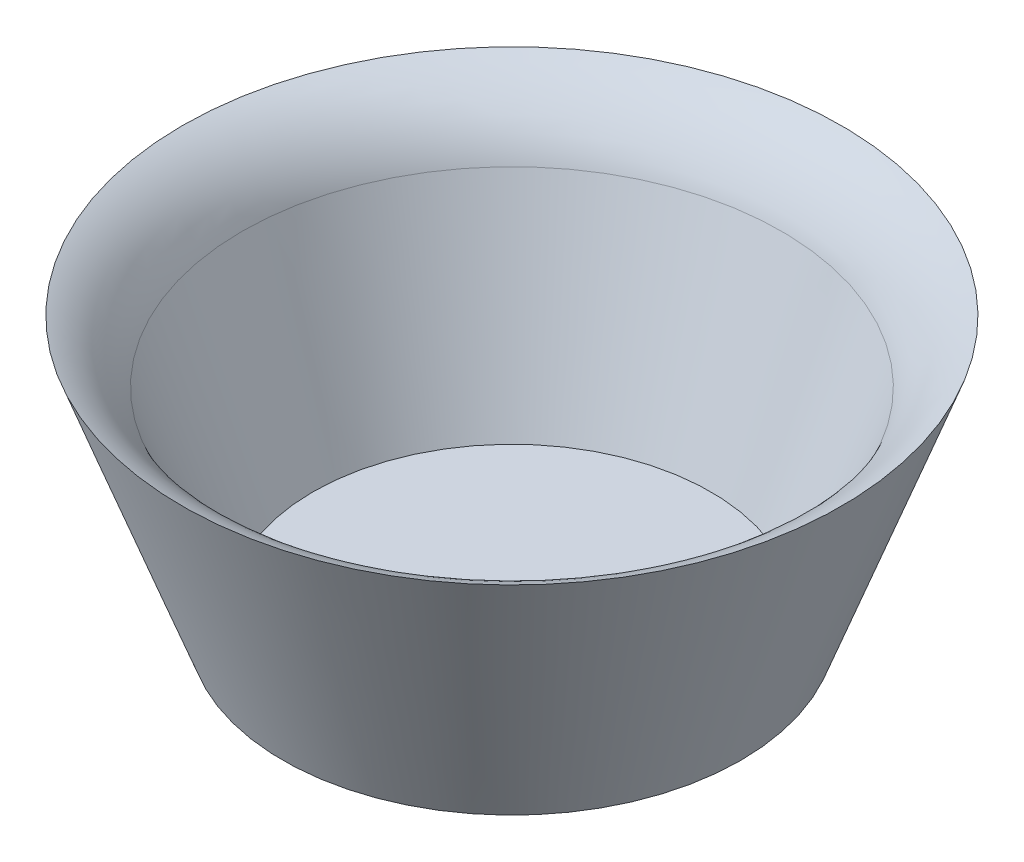
ISO-10303-21;
HEADER;
FILE_DESCRIPTION(('STEP AP214'),'2;1');
FILE_NAME('part.step','',(''),(''),'','','');
FILE_SCHEMA(('AUTOMOTIVE_DESIGN { 1 0 10303 214 1 1 1 1 }'));
ENDSEC;
DATA;
#1=APPLICATION_CONTEXT('core data for automotive mechanical design processes');
#2=APPLICATION_PROTOCOL_DEFINITION('international standard','automotive_design',2000,#1);
#3=PRODUCT_CONTEXT('',#1,'mechanical');
#4=PRODUCT('Part','Part','',(#3));
#5=PRODUCT_RELATED_PRODUCT_CATEGORY('part','',(#4));
#6=PRODUCT_DEFINITION_FORMATION('','',#4);
#7=PRODUCT_DEFINITION_CONTEXT('part definition',#1,'design');
#8=PRODUCT_DEFINITION('design','',#6,#7);
#9=PRODUCT_DEFINITION_SHAPE('','',#8);
#10=(LENGTH_UNIT() NAMED_UNIT(*) SI_UNIT(.MILLI.,.METRE.));
#11=(NAMED_UNIT(*) PLANE_ANGLE_UNIT() SI_UNIT($,.RADIAN.));
#12=(NAMED_UNIT(*) SI_UNIT($,.STERADIAN.) SOLID_ANGLE_UNIT());
#13=UNCERTAINTY_MEASURE_WITH_UNIT(LENGTH_MEASURE(1.E-05),#10,'distance_accuracy_value','');
#14=(GEOMETRIC_REPRESENTATION_CONTEXT(3) GLOBAL_UNCERTAINTY_ASSIGNED_CONTEXT((#13)) GLOBAL_UNIT_ASSIGNED_CONTEXT((#10,
#11,#12)) REPRESENTATION_CONTEXT('',''));
#15=CARTESIAN_POINT('',(0.,0.,0.));
#16=DIRECTION('',(0.,0.,1.));
#17=DIRECTION('',(1.,0.,0.));
#18=AXIS2_PLACEMENT_3D('',#15,#16,#17);
#19=CARTESIAN_POINT('',(-37.366811809944,0.,0.));
#20=DIRECTION('',(0.,1.,0.));
#21=DIRECTION('',(-1.,0.,0.));
#22=AXIS2_PLACEMENT_3D('',#19,#20,#21);
#23=PLANE('',#22);
#24=CARTESIAN_POINT('',(0.,0.,0.));
#25=DIRECTION('',(0.,1.,0.));
#26=DIRECTION('',(-1.,0.,0.));
#27=AXIS2_PLACEMENT_3D('',#24,#25,#26);
#28=CIRCLE('',#27,37.366811809944);
#29=CARTESIAN_POINT('',(-37.366811809944,0.,0.));
#30=VERTEX_POINT('',#29);
#31=EDGE_CURVE('E49',#30,#30,#28,.T.);
#32=ORIENTED_EDGE('',*,*,#31,.T.);
#33=EDGE_LOOP('',(#32));
#34=FACE_BOUND('',#33,.T.);
#35=ADVANCED_FACE('F34',(#34),#23,.T.);
#36=CARTESIAN_POINT('',(0.,-3.5,0.));
#37=DIRECTION('',(0.,-1.,0.));
#38=DIRECTION('',(1.,0.,0.));
#39=AXIS2_PLACEMENT_3D('',#36,#37,#38);
#40=PLANE('',#39);
#41=CARTESIAN_POINT('',(0.,-3.5,0.));
#42=DIRECTION('',(0.,1.,0.));
#43=DIRECTION('',(-1.,0.,0.));
#44=AXIS2_PLACEMENT_3D('',#41,#42,#43);
#45=CIRCLE('',#44,43.);
#46=CARTESIAN_POINT('',(-43.,-3.5,0.));
#47=VERTEX_POINT('',#46);
#48=EDGE_CURVE('E41',#47,#47,#45,.T.);
#49=ORIENTED_EDGE('',*,*,#48,.F.);
#50=EDGE_LOOP('',(#49));
#51=FACE_BOUND('',#50,.T.);
#52=ADVANCED_FACE('F65',(#51),#40,.T.);
#53=CARTESIAN_POINT('',(0.,47.3,0.));
#54=DIRECTION('',(0.,1.,0.));
#55=DIRECTION('',(-1.,0.,0.));
#56=AXIS2_PLACEMENT_3D('',#53,#54,#55);
#57=CONICAL_SURFACE('',#56,61.8972697995203,0.356132232829409);
#58=ORIENTED_EDGE('',*,*,#48,.T.);
#59=EDGE_LOOP('',(#58));
#60=FACE_BOUND('',#59,.T.);
#61=CARTESIAN_POINT('',(0.,47.3,0.));
#62=DIRECTION('',(0.,1.,0.));
#63=DIRECTION('',(-1.,0.,0.));
#64=AXIS2_PLACEMENT_3D('',#61,#62,#63);
#65=CIRCLE('',#64,61.8972697995203);
#66=CARTESIAN_POINT('',(-61.8972697995203,47.3,0.));
#67=VERTEX_POINT('',#66);
#68=EDGE_CURVE('E45',#67,#67,#65,.T.);
#69=ORIENTED_EDGE('',*,*,#68,.F.);
#70=EDGE_LOOP('',(#69));
#71=FACE_BOUND('',#70,.T.);
#72=ADVANCED_FACE('F58',(#60,#71),#57,.T.);
#73=CARTESIAN_POINT('',(0.,0.,0.));
#74=DIRECTION('',(0.,1.,0.));
#75=DIRECTION('',(-1.,0.,0.));
#76=AXIS2_PLACEMENT_3D('',#73,#74,#75);
#77=CONICAL_SURFACE('',#76,37.366811809944,0.356132232829409);
#78=CARTESIAN_POINT('',(0.,35.7358087804949,0.));
#79=DIRECTION('',(0.,1.,0.));
#80=DIRECTION('',(-1.,0.,0.));
#81=AXIS2_PLACEMENT_3D('',#78,#79,#80);
#82=CIRCLE('',#81,50.6603003931936);
#83=CARTESIAN_POINT('',(-50.6603003931936,35.7358087804949,0.));
#84=VERTEX_POINT('',#83);
#85=EDGE_CURVE('E10',#84,#84,#82,.T.);
#86=ORIENTED_EDGE('',*,*,#85,.T.);
#87=EDGE_LOOP('',(#86));
#88=FACE_BOUND('',#87,.T.);
#89=ORIENTED_EDGE('',*,*,#31,.F.);
#90=EDGE_LOOP('',(#89));
#91=FACE_BOUND('',#90,.T.);
#92=ADVANCED_FACE('F56',(#88,#91),#77,.F.);
#93=CARTESIAN_POINT('',(0.,28.7627732535136,0.));
#94=DIRECTION('',(0.,1.,0.));
#95=DIRECTION('',(-1.,0.,0.));
#96=AXIS2_PLACEMENT_3D('',#93,#94,#95);
#97=TOROIDAL_SURFACE('',#96,69.4053470866392,20.);
#98=ORIENTED_EDGE('',*,*,#68,.T.);
#99=EDGE_LOOP('',(#98));
#100=FACE_BOUND('',#99,.T.);
#101=ORIENTED_EDGE('',*,*,#85,.F.);
#102=EDGE_LOOP('',(#101));
#103=FACE_BOUND('',#102,.T.);
#104=ADVANCED_FACE('F36',(#100,#103),#97,.T.);
#105=CLOSED_SHELL('',(#35,#52,#72,#92,#104));
#106=MANIFOLD_SOLID_BREP('B2',#105);
#107=ADVANCED_BREP_SHAPE_REPRESENTATION('',(#18,#106),#14);
#108=SHAPE_DEFINITION_REPRESENTATION(#9,#107);
ENDSEC;
END-ISO-10303-21;
